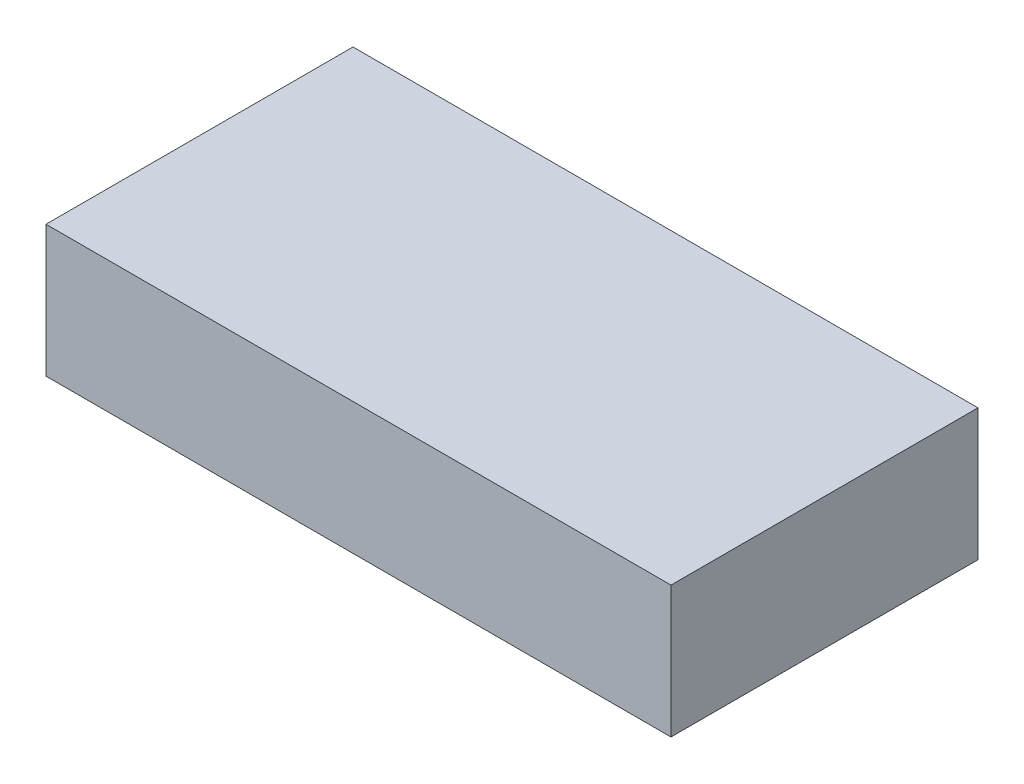
ISO-10303-21;
HEADER;
FILE_DESCRIPTION(('STEP AP214'),'2;1');
FILE_NAME('part.step','',(''),(''),'','','');
FILE_SCHEMA(('AUTOMOTIVE_DESIGN { 1 0 10303 214 1 1 1 1 }'));
ENDSEC;
DATA;
#1=APPLICATION_CONTEXT('core data for automotive mechanical design processes');
#2=APPLICATION_PROTOCOL_DEFINITION('international standard','automotive_design',2000,#1);
#3=PRODUCT_CONTEXT('',#1,'mechanical');
#4=PRODUCT('Part','Part','',(#3));
#5=PRODUCT_RELATED_PRODUCT_CATEGORY('part','',(#4));
#6=PRODUCT_DEFINITION_FORMATION('','',#4);
#7=PRODUCT_DEFINITION_CONTEXT('part definition',#1,'design');
#8=PRODUCT_DEFINITION('design','',#6,#7);
#9=PRODUCT_DEFINITION_SHAPE('','',#8);
#10=(LENGTH_UNIT() NAMED_UNIT(*) SI_UNIT(.MILLI.,.METRE.));
#11=(NAMED_UNIT(*) PLANE_ANGLE_UNIT() SI_UNIT($,.RADIAN.));
#12=(NAMED_UNIT(*) SI_UNIT($,.STERADIAN.) SOLID_ANGLE_UNIT());
#13=UNCERTAINTY_MEASURE_WITH_UNIT(LENGTH_MEASURE(1.E-05),#10,'distance_accuracy_value','');
#14=(GEOMETRIC_REPRESENTATION_CONTEXT(3) GLOBAL_UNCERTAINTY_ASSIGNED_CONTEXT((#13)) GLOBAL_UNIT_ASSIGNED_CONTEXT((#10,
#11,#12)) REPRESENTATION_CONTEXT('',''));
#15=CARTESIAN_POINT('',(0.,0.,0.));
#16=DIRECTION('',(0.,0.,1.));
#17=DIRECTION('',(1.,0.,0.));
#18=AXIS2_PLACEMENT_3D('',#15,#16,#17);
#19=CARTESIAN_POINT('',(90.4875,-19.05,-44.4500000000001));
#20=DIRECTION('',(0.,0.,1.));
#21=DIRECTION('',(1.,0.,0.));
#22=AXIS2_PLACEMENT_3D('',#19,#20,#21);
#23=PLANE('',#22);
#24=DIRECTION('',(0.,1.,0.));
#25=VECTOR('',#24,1.);
#26=CARTESIAN_POINT('',(-90.4875,-19.05,-44.4499999999999));
#27=LINE('',#26,#25);
#28=CARTESIAN_POINT('',(-90.4875,-19.05,-44.4499999999999));
#29=VERTEX_POINT('',#28);
#30=CARTESIAN_POINT('',(-90.4875,19.05,-44.4499999999999));
#31=VERTEX_POINT('',#30);
#32=EDGE_CURVE('E111',#29,#31,#27,.T.);
#33=ORIENTED_EDGE('',*,*,#32,.T.);
#34=DIRECTION('',(-1.,0.,0.));
#35=VECTOR('',#34,1.);
#36=CARTESIAN_POINT('',(90.4875,19.05,-44.4500000000001));
#37=LINE('',#36,#35);
#38=CARTESIAN_POINT('',(90.4875,19.05,-44.4500000000001));
#39=VERTEX_POINT('',#38);
#40=EDGE_CURVE('E11',#39,#31,#37,.T.);
#41=ORIENTED_EDGE('',*,*,#40,.F.);
#42=DIRECTION('',(0.,1.,0.));
#43=VECTOR('',#42,1.);
#44=CARTESIAN_POINT('',(90.4875,-19.05,-44.4500000000001));
#45=LINE('',#44,#43);
#46=CARTESIAN_POINT('',(90.4875,-19.05,-44.4500000000001));
#47=VERTEX_POINT('',#46);
#48=EDGE_CURVE('E93',#47,#39,#45,.T.);
#49=ORIENTED_EDGE('',*,*,#48,.F.);
#50=DIRECTION('',(-1.,0.,0.));
#51=VECTOR('',#50,1.);
#52=CARTESIAN_POINT('',(90.4875,-19.05,-44.4500000000001));
#53=LINE('',#52,#51);
#54=EDGE_CURVE('E107',#47,#29,#53,.T.);
#55=ORIENTED_EDGE('',*,*,#54,.T.);
#56=EDGE_LOOP('',(#33,#41,#49,#55));
#57=FACE_BOUND('',#56,.T.);
#58=ADVANCED_FACE('F41',(#57),#23,.F.);
#59=CARTESIAN_POINT('',(90.4875,19.05,44.45));
#60=DIRECTION('',(0.,-1.,0.));
#61=DIRECTION('',(0.,0.,-1.));
#62=AXIS2_PLACEMENT_3D('',#59,#60,#61);
#63=PLANE('',#62);
#64=DIRECTION('',(0.,0.,1.));
#65=VECTOR('',#64,1.);
#66=CARTESIAN_POINT('',(-90.4875,19.05,44.45));
#67=LINE('',#66,#65);
#68=CARTESIAN_POINT('',(-90.4875,19.05,44.45));
#69=VERTEX_POINT('',#68);
#70=EDGE_CURVE('E98',#31,#69,#67,.T.);
#71=ORIENTED_EDGE('',*,*,#70,.T.);
#72=DIRECTION('',(-1.,0.,0.));
#73=VECTOR('',#72,1.);
#74=CARTESIAN_POINT('',(90.4875,19.05,44.45));
#75=LINE('',#74,#73);
#76=CARTESIAN_POINT('',(90.4875,19.05,44.45));
#77=VERTEX_POINT('',#76);
#78=EDGE_CURVE('E50',#77,#69,#75,.T.);
#79=ORIENTED_EDGE('',*,*,#78,.F.);
#80=DIRECTION('',(0.,0.,1.));
#81=VECTOR('',#80,1.);
#82=CARTESIAN_POINT('',(90.4875,19.05,44.45));
#83=LINE('',#82,#81);
#84=EDGE_CURVE('E88',#39,#77,#83,.T.);
#85=ORIENTED_EDGE('',*,*,#84,.F.);
#86=ORIENTED_EDGE('',*,*,#40,.T.);
#87=EDGE_LOOP('',(#71,#79,#85,#86));
#88=FACE_BOUND('',#87,.T.);
#89=ADVANCED_FACE('F97',(#88),#63,.F.);
#90=CARTESIAN_POINT('',(90.4875,-19.05,44.45));
#91=DIRECTION('',(0.,0.,-1.));
#92=DIRECTION('',(-1.,0.,0.));
#93=AXIS2_PLACEMENT_3D('',#90,#91,#92);
#94=PLANE('',#93);
#95=DIRECTION('',(0.,-1.,0.));
#96=VECTOR('',#95,1.);
#97=CARTESIAN_POINT('',(-90.4875,-19.05,44.45));
#98=LINE('',#97,#96);
#99=CARTESIAN_POINT('',(-90.4875,-19.05,44.45));
#100=VERTEX_POINT('',#99);
#101=EDGE_CURVE('E75',#69,#100,#98,.T.);
#102=ORIENTED_EDGE('',*,*,#101,.T.);
#103=DIRECTION('',(-1.,0.,0.));
#104=VECTOR('',#103,1.);
#105=CARTESIAN_POINT('',(90.4875,-19.05,44.45));
#106=LINE('',#105,#104);
#107=CARTESIAN_POINT('',(90.4875,-19.05,44.45));
#108=VERTEX_POINT('',#107);
#109=EDGE_CURVE('E100',#108,#100,#106,.T.);
#110=ORIENTED_EDGE('',*,*,#109,.F.);
#111=DIRECTION('',(0.,-1.,0.));
#112=VECTOR('',#111,1.);
#113=CARTESIAN_POINT('',(90.4875,-19.05,44.45));
#114=LINE('',#113,#112);
#115=EDGE_CURVE('E91',#77,#108,#114,.T.);
#116=ORIENTED_EDGE('',*,*,#115,.F.);
#117=ORIENTED_EDGE('',*,*,#78,.T.);
#118=EDGE_LOOP('',(#102,#110,#116,#117));
#119=FACE_BOUND('',#118,.T.);
#120=ADVANCED_FACE('F101',(#119),#94,.F.);
#121=CARTESIAN_POINT('',(90.4875,-19.05,44.45));
#122=DIRECTION('',(0.,1.,0.));
#123=DIRECTION('',(0.,0.,1.));
#124=AXIS2_PLACEMENT_3D('',#121,#122,#123);
#125=PLANE('',#124);
#126=DIRECTION('',(0.,0.,-1.));
#127=VECTOR('',#126,1.);
#128=CARTESIAN_POINT('',(-90.4875,-19.05,44.45));
#129=LINE('',#128,#127);
#130=EDGE_CURVE('E81',#100,#29,#129,.T.);
#131=ORIENTED_EDGE('',*,*,#130,.T.);
#132=ORIENTED_EDGE('',*,*,#54,.F.);
#133=DIRECTION('',(0.,0.,-1.));
#134=VECTOR('',#133,1.);
#135=CARTESIAN_POINT('',(90.4875,-19.05,44.45));
#136=LINE('',#135,#134);
#137=EDGE_CURVE('E58',#108,#47,#136,.T.);
#138=ORIENTED_EDGE('',*,*,#137,.F.);
#139=ORIENTED_EDGE('',*,*,#109,.T.);
#140=EDGE_LOOP('',(#131,#132,#138,#139));
#141=FACE_BOUND('',#140,.T.);
#142=ADVANCED_FACE('F126',(#141),#125,.F.);
#143=CARTESIAN_POINT('',(90.4875,0.,0.));
#144=DIRECTION('',(-1.,0.,0.));
#145=DIRECTION('',(0.,0.,1.));
#146=AXIS2_PLACEMENT_3D('',#143,#144,#145);
#147=PLANE('',#146);
#148=ORIENTED_EDGE('',*,*,#48,.T.);
#149=ORIENTED_EDGE('',*,*,#84,.T.);
#150=ORIENTED_EDGE('',*,*,#115,.T.);
#151=ORIENTED_EDGE('',*,*,#137,.T.);
#152=EDGE_LOOP('',(#148,#149,#150,#151));
#153=FACE_BOUND('',#152,.T.);
#154=ADVANCED_FACE('F89',(#153),#147,.F.);
#155=CARTESIAN_POINT('',(-90.4875,0.,0.));
#156=DIRECTION('',(-1.,0.,0.));
#157=DIRECTION('',(0.,0.,1.));
#158=AXIS2_PLACEMENT_3D('',#155,#156,#157);
#159=PLANE('',#158);
#160=ORIENTED_EDGE('',*,*,#32,.F.);
#161=ORIENTED_EDGE('',*,*,#130,.F.);
#162=ORIENTED_EDGE('',*,*,#101,.F.);
#163=ORIENTED_EDGE('',*,*,#70,.F.);
#164=EDGE_LOOP('',(#160,#161,#162,#163));
#165=FACE_BOUND('',#164,.T.);
#166=ADVANCED_FACE('F129',(#165),#159,.T.);
#167=CLOSED_SHELL('',(#58,#89,#120,#142,#154,#166));
#168=MANIFOLD_SOLID_BREP('B2',#167);
#169=ADVANCED_BREP_SHAPE_REPRESENTATION('',(#18,#168),#14);
#170=SHAPE_DEFINITION_REPRESENTATION(#9,#169);
ENDSEC;
END-ISO-10303-21;
